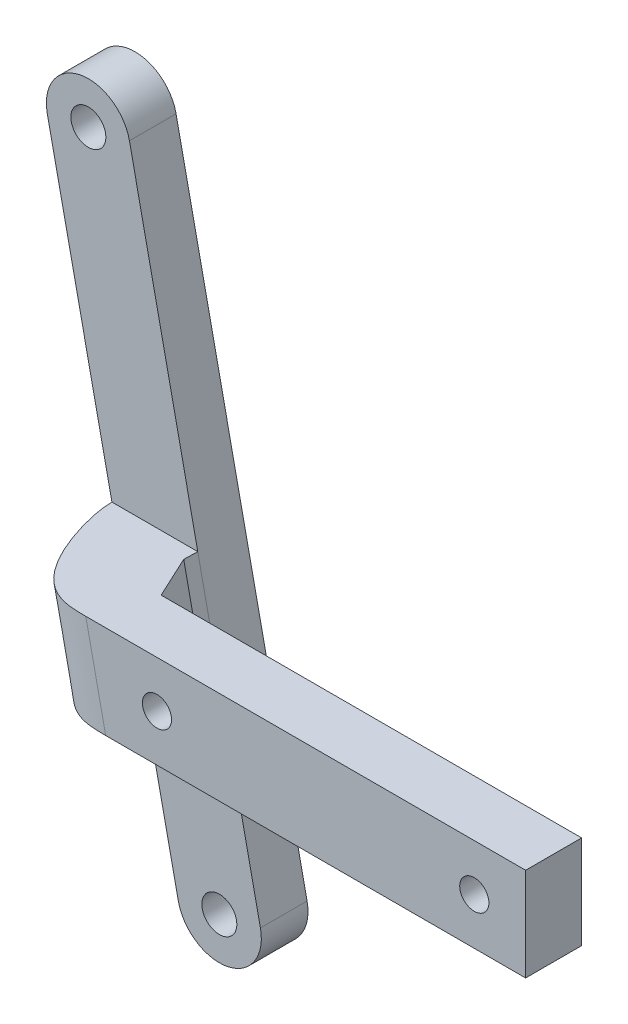
ISO-10303-21;
HEADER;
FILE_DESCRIPTION(('STEP AP214'),'2;1');
FILE_NAME('part.step','',(''),(''),'','','');
FILE_SCHEMA(('AUTOMOTIVE_DESIGN { 1 0 10303 214 1 1 1 1 }'));
ENDSEC;
DATA;
#1=APPLICATION_CONTEXT('core data for automotive mechanical design processes');
#2=APPLICATION_PROTOCOL_DEFINITION('international standard','automotive_design',2000,#1);
#3=PRODUCT_CONTEXT('',#1,'mechanical');
#4=PRODUCT('Part','Part','',(#3));
#5=PRODUCT_RELATED_PRODUCT_CATEGORY('part','',(#4));
#6=PRODUCT_DEFINITION_FORMATION('','',#4);
#7=PRODUCT_DEFINITION_CONTEXT('part definition',#1,'design');
#8=PRODUCT_DEFINITION('design','',#6,#7);
#9=PRODUCT_DEFINITION_SHAPE('','',#8);
#10=(LENGTH_UNIT() NAMED_UNIT(*) SI_UNIT(.MILLI.,.METRE.));
#11=(NAMED_UNIT(*) PLANE_ANGLE_UNIT() SI_UNIT($,.RADIAN.));
#12=(NAMED_UNIT(*) SI_UNIT($,.STERADIAN.) SOLID_ANGLE_UNIT());
#13=UNCERTAINTY_MEASURE_WITH_UNIT(LENGTH_MEASURE(1.E-05),#10,'distance_accuracy_value','');
#14=(GEOMETRIC_REPRESENTATION_CONTEXT(3) GLOBAL_UNCERTAINTY_ASSIGNED_CONTEXT((#13)) GLOBAL_UNIT_ASSIGNED_CONTEXT((#10,
#11,#12)) REPRESENTATION_CONTEXT('',''));
#15=CARTESIAN_POINT('',(0.,0.,0.));
#16=DIRECTION('',(0.,0.,1.));
#17=DIRECTION('',(1.,0.,0.));
#18=AXIS2_PLACEMENT_3D('',#15,#16,#17);
#19=CARTESIAN_POINT('',(0.,0.,10.));
#20=DIRECTION('',(0.,0.,1.));
#21=DIRECTION('',(1.,0.,0.));
#22=AXIS2_PLACEMENT_3D('',#19,#20,#21);
#23=PLANE('',#22);
#24=DIRECTION('',(-1.,0.,0.));
#25=VECTOR('',#24,1.);
#26=CARTESIAN_POINT('',(5.05083639806039,-67.049926099064,10.));
#27=LINE('',#26,#25);
#28=CARTESIAN_POINT('',(23.4529671056309,-67.0499260990639,10.));
#29=VERTEX_POINT('',#28);
#30=CARTESIAN_POINT('',(5.05083639806039,-67.0499260990639,10.));
#31=VERTEX_POINT('',#30);
#32=EDGE_CURVE('E357',#29,#31,#27,.T.);
#33=ORIENTED_EDGE('',*,*,#32,.F.);
#34=DIRECTION('',(-0.207911690817753,0.978147600733807,0.));
#35=VECTOR('',#34,1.);
#36=CARTESIAN_POINT('',(8.80332840660426,1.87120521735977,10.));
#37=LINE('',#36,#35);
#38=CARTESIAN_POINT('',(8.80332840660426,1.87120521735977,10.));
#39=VERTEX_POINT('',#38);
#40=EDGE_CURVE('E534',#29,#39,#37,.T.);
#41=ORIENTED_EDGE('',*,*,#40,.T.);
#42=CARTESIAN_POINT('',(0.,0.,10.));
#43=DIRECTION('',(0.,0.,1.));
#44=DIRECTION('',(1.,0.,0.));
#45=AXIS2_PLACEMENT_3D('',#42,#43,#44);
#46=CIRCLE('',#45,9.);
#47=CARTESIAN_POINT('',(-8.80332840660426,-1.87120521735977,10.));
#48=VERTEX_POINT('',#47);
#49=EDGE_CURVE('E519',#39,#48,#46,.T.);
#50=ORIENTED_EDGE('',*,*,#49,.T.);
#51=DIRECTION('',(0.207911690817753,-0.978147600733807,0.));
#52=VECTOR('',#51,1.);
#53=CARTESIAN_POINT('',(-8.80332840660426,-1.87120521735977,10.));
#54=LINE('',#53,#52);
#55=EDGE_CURVE('E562',#48,#31,#54,.T.);
#56=ORIENTED_EDGE('',*,*,#55,.T.);
#57=EDGE_LOOP('',(#33,#41,#50,#56));
#58=FACE_BOUND('',#57,.T.);
#59=CARTESIAN_POINT('',(0.,0.,10.));
#60=DIRECTION('',(0.,0.,1.));
#61=DIRECTION('',(1.,0.,0.));
#62=AXIS2_PLACEMENT_3D('',#59,#60,#61);
#63=CIRCLE('',#62,3.75);
#64=CARTESIAN_POINT('',(3.75,0.,10.));
#65=VERTEX_POINT('',#64);
#66=EDGE_CURVE('E541',#65,#65,#63,.T.);
#67=ORIENTED_EDGE('',*,*,#66,.F.);
#68=EDGE_LOOP('',(#67));
#69=FACE_BOUND('',#68,.T.);
#70=ADVANCED_FACE('F141',(#58,#69),#23,.T.);
#71=DIRECTION('',(1.,0.,0.));
#72=VECTOR('',#71,1.);
#73=CARTESIAN_POINT('',(27.7040983390312,-87.0499260990639,10.));
#74=LINE('',#73,#72);
#75=CARTESIAN_POINT('',(9.30196763146069,-87.0499260990639,10.));
#76=VERTEX_POINT('',#75);
#77=CARTESIAN_POINT('',(27.7040983390312,-87.0499260990639,10.));
#78=VERTEX_POINT('',#77);
#79=EDGE_CURVE('E297',#76,#78,#74,.T.);
#80=ORIENTED_EDGE('',*,*,#79,.F.);
#81=CARTESIAN_POINT('',(19.2647498537924,-133.921131316424,10.));
#82=VERTEX_POINT('',#81);
#83=EDGE_CURVE('E557',#76,#82,#54,.T.);
#84=ORIENTED_EDGE('',*,*,#83,.T.);
#85=CARTESIAN_POINT('',(28.0680782603966,-132.049926099064,10.));
#86=DIRECTION('',(0.,0.,1.));
#87=DIRECTION('',(1.,0.,0.));
#88=AXIS2_PLACEMENT_3D('',#85,#86,#87);
#89=CIRCLE('',#88,9.);
#90=CARTESIAN_POINT('',(36.8714066670009,-130.178720881704,10.));
#91=VERTEX_POINT('',#90);
#92=EDGE_CURVE('E509',#82,#91,#89,.T.);
#93=ORIENTED_EDGE('',*,*,#92,.T.);
#94=EDGE_CURVE('E527',#91,#78,#37,.T.);
#95=ORIENTED_EDGE('',*,*,#94,.T.);
#96=EDGE_LOOP('',(#80,#84,#93,#95));
#97=FACE_BOUND('',#96,.T.);
#98=CARTESIAN_POINT('',(28.0680782603966,-132.049926099064,10.));
#99=DIRECTION('',(0.,0.,1.));
#100=DIRECTION('',(1.,0.,0.));
#101=AXIS2_PLACEMENT_3D('',#98,#99,#100);
#102=CIRCLE('',#101,3.75000000000001);
#103=CARTESIAN_POINT('',(31.8180782603966,-132.049926099064,10.));
#104=VERTEX_POINT('',#103);
#105=EDGE_CURVE('E550',#104,#104,#102,.T.);
#106=ORIENTED_EDGE('',*,*,#105,.F.);
#107=EDGE_LOOP('',(#106));
#108=FACE_BOUND('',#107,.T.);
#109=ADVANCED_FACE('F465',(#97,#108),#23,.T.);
#110=CARTESIAN_POINT('',(0.,0.,0.));
#111=DIRECTION('',(0.,0.,1.));
#112=DIRECTION('',(1.,0.,0.));
#113=AXIS2_PLACEMENT_3D('',#110,#111,#112);
#114=PLANE('',#113);
#115=CARTESIAN_POINT('',(0.,0.,0.));
#116=DIRECTION('',(0.,0.,1.));
#117=DIRECTION('',(1.,0.,0.));
#118=AXIS2_PLACEMENT_3D('',#115,#116,#117);
#119=CIRCLE('',#118,9.);
#120=CARTESIAN_POINT('',(8.80332840660426,1.87120521735977,0.));
#121=VERTEX_POINT('',#120);
#122=CARTESIAN_POINT('',(-8.80332840660426,-1.87120521735977,0.));
#123=VERTEX_POINT('',#122);
#124=EDGE_CURVE('E505',#121,#123,#119,.T.);
#125=ORIENTED_EDGE('',*,*,#124,.F.);
#126=DIRECTION('',(-0.207911690817753,0.978147600733807,0.));
#127=VECTOR('',#126,1.);
#128=CARTESIAN_POINT('',(8.80332840660426,1.87120521735977,0.));
#129=LINE('',#128,#127);
#130=CARTESIAN_POINT('',(36.8714066670009,-130.178720881704,0.));
#131=VERTEX_POINT('',#130);
#132=EDGE_CURVE('E515',#131,#121,#129,.T.);
#133=ORIENTED_EDGE('',*,*,#132,.F.);
#134=CARTESIAN_POINT('',(28.0680782603966,-132.049926099064,0.));
#135=DIRECTION('',(0.,0.,1.));
#136=DIRECTION('',(1.,0.,0.));
#137=AXIS2_PLACEMENT_3D('',#134,#135,#136);
#138=CIRCLE('',#137,9.);
#139=CARTESIAN_POINT('',(19.2647498537924,-133.921131316424,0.));
#140=VERTEX_POINT('',#139);
#141=EDGE_CURVE('E504',#140,#131,#138,.T.);
#142=ORIENTED_EDGE('',*,*,#141,.F.);
#143=DIRECTION('',(0.207911690817753,-0.978147600733807,0.));
#144=VECTOR('',#143,1.);
#145=CARTESIAN_POINT('',(-8.80332840660426,-1.87120521735977,0.));
#146=LINE('',#145,#144);
#147=EDGE_CURVE('E495',#123,#140,#146,.T.);
#148=ORIENTED_EDGE('',*,*,#147,.F.);
#149=EDGE_LOOP('',(#125,#133,#142,#148));
#150=FACE_BOUND('',#149,.T.);
#151=CARTESIAN_POINT('',(0.,0.,0.));
#152=DIRECTION('',(0.,0.,1.));
#153=DIRECTION('',(1.,0.,0.));
#154=AXIS2_PLACEMENT_3D('',#151,#152,#153);
#155=CIRCLE('',#154,3.75);
#156=CARTESIAN_POINT('',(3.75,0.,0.));
#157=VERTEX_POINT('',#156);
#158=EDGE_CURVE('E544',#157,#157,#155,.T.);
#159=ORIENTED_EDGE('',*,*,#158,.T.);
#160=EDGE_LOOP('',(#159));
#161=FACE_BOUND('',#160,.T.);
#162=CARTESIAN_POINT('',(28.0680782603966,-132.049926099064,0.));
#163=DIRECTION('',(0.,0.,1.));
#164=DIRECTION('',(1.,0.,0.));
#165=AXIS2_PLACEMENT_3D('',#162,#163,#164);
#166=CIRCLE('',#165,3.75000000000001);
#167=CARTESIAN_POINT('',(31.8180782603966,-132.049926099064,0.));
#168=VERTEX_POINT('',#167);
#169=EDGE_CURVE('E553',#168,#168,#166,.T.);
#170=ORIENTED_EDGE('',*,*,#169,.T.);
#171=EDGE_LOOP('',(#170));
#172=FACE_BOUND('',#171,.T.);
#173=ADVANCED_FACE('F471',(#150,#161,#172),#114,.F.);
#174=CARTESIAN_POINT('',(0.,0.,10.));
#175=DIRECTION('',(0.,0.,-1.));
#176=DIRECTION('',(-1.,0.,0.));
#177=AXIS2_PLACEMENT_3D('',#174,#175,#176);
#178=CYLINDRICAL_SURFACE('',#177,9.);
#179=ORIENTED_EDGE('',*,*,#124,.T.);
#180=DIRECTION('',(0.,0.,-1.));
#181=VECTOR('',#180,1.);
#182=CARTESIAN_POINT('',(-8.80332840660426,-1.87120521735977,10.));
#183=LINE('',#182,#181);
#184=EDGE_CURVE('E12',#48,#123,#183,.T.);
#185=ORIENTED_EDGE('',*,*,#184,.F.);
#186=ORIENTED_EDGE('',*,*,#49,.F.);
#187=DIRECTION('',(0.,0.,-1.));
#188=VECTOR('',#187,1.);
#189=CARTESIAN_POINT('',(8.80332840660426,1.87120521735977,10.));
#190=LINE('',#189,#188);
#191=EDGE_CURVE('E523',#39,#121,#190,.T.);
#192=ORIENTED_EDGE('',*,*,#191,.T.);
#193=EDGE_LOOP('',(#179,#185,#186,#192));
#194=FACE_BOUND('',#193,.T.);
#195=ADVANCED_FACE('F143',(#194),#178,.T.);
#196=CARTESIAN_POINT('',(-8.80332840660426,-1.87120521735977,10.));
#197=DIRECTION('',(0.978147600733807,0.207911690817753,0.));
#198=DIRECTION('',(-0.207911690817753,0.978147600733807,0.));
#199=AXIS2_PLACEMENT_3D('',#196,#197,#198);
#200=PLANE('',#199);
#201=ORIENTED_EDGE('',*,*,#147,.T.);
#202=DIRECTION('',(0.,0.,-1.));
#203=VECTOR('',#202,1.);
#204=CARTESIAN_POINT('',(19.2647498537924,-133.921131316424,10.));
#205=LINE('',#204,#203);
#206=EDGE_CURVE('E152',#82,#140,#205,.T.);
#207=ORIENTED_EDGE('',*,*,#206,.F.);
#208=ORIENTED_EDGE('',*,*,#83,.F.);
#209=DIRECTION('',(0.207911690817753,-0.978147600733807,0.));
#210=VECTOR('',#209,1.);
#211=CARTESIAN_POINT('',(9.3019676314607,-87.0499260990639,10.));
#212=LINE('',#211,#210);
#213=EDGE_CURVE('E346',#31,#76,#212,.T.);
#214=ORIENTED_EDGE('',*,*,#213,.F.);
#215=ORIENTED_EDGE('',*,*,#55,.F.);
#216=ORIENTED_EDGE('',*,*,#184,.T.);
#217=EDGE_LOOP('',(#201,#207,#208,#214,#215,#216));
#218=FACE_BOUND('',#217,.T.);
#219=ADVANCED_FACE('F486',(#218),#200,.F.);
#220=CARTESIAN_POINT('',(28.0680782603966,-132.049926099064,10.));
#221=DIRECTION('',(0.,0.,-1.));
#222=DIRECTION('',(-1.,0.,0.));
#223=AXIS2_PLACEMENT_3D('',#220,#221,#222);
#224=CYLINDRICAL_SURFACE('',#223,9.);
#225=ORIENTED_EDGE('',*,*,#141,.T.);
#226=DIRECTION('',(0.,0.,-1.));
#227=VECTOR('',#226,1.);
#228=CARTESIAN_POINT('',(36.8714066670009,-130.178720881704,10.));
#229=LINE('',#228,#227);
#230=EDGE_CURVE('E511',#91,#131,#229,.T.);
#231=ORIENTED_EDGE('',*,*,#230,.F.);
#232=ORIENTED_EDGE('',*,*,#92,.F.);
#233=ORIENTED_EDGE('',*,*,#206,.T.);
#234=EDGE_LOOP('',(#225,#231,#232,#233));
#235=FACE_BOUND('',#234,.T.);
#236=ADVANCED_FACE('F483',(#235),#224,.T.);
#237=CARTESIAN_POINT('',(8.80332840660426,1.87120521735977,10.));
#238=DIRECTION('',(-0.978147600733807,-0.207911690817753,0.));
#239=DIRECTION('',(0.207911690817753,-0.978147600733807,0.));
#240=AXIS2_PLACEMENT_3D('',#237,#238,#239);
#241=PLANE('',#240);
#242=ORIENTED_EDGE('',*,*,#132,.T.);
#243=ORIENTED_EDGE('',*,*,#191,.F.);
#244=ORIENTED_EDGE('',*,*,#40,.F.);
#245=DIRECTION('',(-0.207911690817753,0.978147600733807,0.));
#246=VECTOR('',#245,1.);
#247=CARTESIAN_POINT('',(23.4529671056309,-67.0499260990639,10.));
#248=LINE('',#247,#246);
#249=EDGE_CURVE('E231',#78,#29,#248,.T.);
#250=ORIENTED_EDGE('',*,*,#249,.F.);
#251=ORIENTED_EDGE('',*,*,#94,.F.);
#252=ORIENTED_EDGE('',*,*,#230,.T.);
#253=EDGE_LOOP('',(#242,#243,#244,#250,#251,#252));
#254=FACE_BOUND('',#253,.T.);
#255=ADVANCED_FACE('F480',(#254),#241,.F.);
#256=CARTESIAN_POINT('',(0.,0.,10.));
#257=DIRECTION('',(0.,0.,-1.));
#258=DIRECTION('',(-1.,0.,0.));
#259=AXIS2_PLACEMENT_3D('',#256,#257,#258);
#260=CYLINDRICAL_SURFACE('',#259,3.75);
#261=ORIENTED_EDGE('',*,*,#66,.T.);
#262=EDGE_LOOP('',(#261));
#263=FACE_BOUND('',#262,.T.);
#264=ORIENTED_EDGE('',*,*,#158,.F.);
#265=EDGE_LOOP('',(#264));
#266=FACE_BOUND('',#265,.T.);
#267=ADVANCED_FACE('F476',(#263,#266),#260,.F.);
#268=CARTESIAN_POINT('',(28.0680782603966,-132.049926099064,10.));
#269=DIRECTION('',(0.,0.,-1.));
#270=DIRECTION('',(-1.,0.,0.));
#271=AXIS2_PLACEMENT_3D('',#268,#269,#270);
#272=CYLINDRICAL_SURFACE('',#271,3.75000000000001);
#273=ORIENTED_EDGE('',*,*,#105,.T.);
#274=EDGE_LOOP('',(#273));
#275=FACE_BOUND('',#274,.T.);
#276=ORIENTED_EDGE('',*,*,#169,.F.);
#277=EDGE_LOOP('',(#276));
#278=FACE_BOUND('',#277,.T.);
#279=ADVANCED_FACE('F389',(#275,#278),#272,.F.);
#280=CARTESIAN_POINT('',(23.0929671056309,-67.0499260990639,18.25));
#281=DIRECTION('',(0.,1.,0.));
#282=DIRECTION('',(0.,0.,1.));
#283=AXIS2_PLACEMENT_3D('',#280,#281,#282);
#284=PLANE('',#283);
#285=CARTESIAN_POINT('',(5.05083639806039,-67.049926099064,10.));
#286=CARTESIAN_POINT('',(5.05083639806039,-67.049926099064,14.9248597902253));
#287=CARTESIAN_POINT('',(7.43768095626114,-67.049926099064,22.1248597902253));
#288=CARTESIAN_POINT('',(10.9177884893493,-67.0499260990639,34.));
#289=CARTESIAN_POINT('',(17.1853777974901,-67.0499260990639,34.));
#290=CARTESIAN_POINT('',(23.4529671056309,-67.0499260990639,34.));
#291=B_SPLINE_CURVE_WITH_KNOTS('',5,(#285,#286,#287,#288,#289,#290),.UNSPECIFIED.,.F.,.F.,(6,6),
(0.,1.),.UNSPECIFIED.);
#292=CARTESIAN_POINT('',(23.4529671056309,-67.0499260990639,34.));
#293=VERTEX_POINT('',#292);
#294=EDGE_CURVE('E345',#31,#293,#291,.T.);
#295=ORIENTED_EDGE('',*,*,#294,.T.);
#296=DIRECTION('',(-1.,0.,0.));
#297=VECTOR('',#296,1.);
#298=CARTESIAN_POINT('',(23.4529671056309,-67.0499260990639,34.));
#299=LINE('',#298,#297);
#300=CARTESIAN_POINT('',(117.704098339031,-67.0499260990639,34.));
#301=VERTEX_POINT('',#300);
#302=EDGE_CURVE('E293',#301,#293,#299,.T.);
#303=ORIENTED_EDGE('',*,*,#302,.F.);
#304=DIRECTION('',(0.,0.,1.));
#305=VECTOR('',#304,1.);
#306=CARTESIAN_POINT('',(117.704098339031,-67.0499260990639,22.));
#307=LINE('',#306,#305);
#308=CARTESIAN_POINT('',(117.704098339031,-67.0499260990639,22.));
#309=VERTEX_POINT('',#308);
#310=EDGE_CURVE('E294',#309,#301,#307,.T.);
#311=ORIENTED_EDGE('',*,*,#310,.F.);
#312=DIRECTION('',(-1.,0.,0.));
#313=VECTOR('',#312,1.);
#314=CARTESIAN_POINT('',(23.4529671056309,-67.0499260990639,22.));
#315=LINE('',#314,#313);
#316=CARTESIAN_POINT('',(27.5966526294072,-67.0499260990639,22.));
#317=VERTEX_POINT('',#316);
#318=EDGE_CURVE('E254',#309,#317,#315,.T.);
#319=ORIENTED_EDGE('',*,*,#318,.T.);
#320=DIRECTION('',(-0.422618261740704,0.,-0.906307787036648));
#321=VECTOR('',#320,1.);
#322=CARTESIAN_POINT('',(23.3704700120002,-67.0499260990639,12.9369221296336));
#323=LINE('',#322,#321);
#324=CARTESIAN_POINT('',(23.3702893362008,-67.0499260990639,12.9365350589413));
#325=VERTEX_POINT('',#324);
#326=EDGE_CURVE('E245',#317,#325,#323,.T.);
#327=ORIENTED_EDGE('',*,*,#326,.T.);
#328=CARTESIAN_POINT('',(23.4529671056309,-67.0499260990639,10.));
#329=CARTESIAN_POINT('',(23.4529671056309,-67.0499260990639,12.4));
#330=CARTESIAN_POINT('',(23.2609671056309,-67.0499260990639,16.));
#331=CARTESIAN_POINT('',(22.6849671056309,-67.0499260990639,22.));
#332=CARTESIAN_POINT('',(23.0689671056309,-67.0499260990639,22.));
#333=CARTESIAN_POINT('',(23.4529671056309,-67.0499260990639,22.));
#334=B_SPLINE_CURVE_WITH_KNOTS('',5,(#328,#329,#330,#331,#332,#333),.UNSPECIFIED.,.F.,.F.,(6,6),
(0.,1.),.UNSPECIFIED.);
#335=EDGE_CURVE('E228',#29,#325,#334,.T.);
#336=ORIENTED_EDGE('',*,*,#335,.F.);
#337=ORIENTED_EDGE('',*,*,#32,.T.);
#338=EDGE_LOOP('',(#295,#303,#311,#319,#327,#336,#337));
#339=FACE_BOUND('',#338,.T.);
#340=ADVANCED_FACE('F252',(#339),#284,.T.);
#341=CARTESIAN_POINT('',(27.7040983390312,-87.0499260990639,10.));
#342=CARTESIAN_POINT('',(27.7040983390312,-87.0499260990639,12.4));
#343=CARTESIAN_POINT('',(27.5120983390312,-87.0499260990639,16.));
#344=CARTESIAN_POINT('',(26.9360983390313,-87.0499260990639,22.));
#345=CARTESIAN_POINT('',(27.3200983390312,-87.0499260990639,22.));
#346=CARTESIAN_POINT('',(27.7040983390312,-87.0499260990639,22.));
#347=CARTESIAN_POINT('',(26.8538720923511,-83.049926099064,10.));
#348=CARTESIAN_POINT('',(26.8538720923511,-83.049926099064,12.3999999999999));
#349=CARTESIAN_POINT('',(26.661872092357,-83.049926098225,16.0000000000755));
#350=CARTESIAN_POINT('',(26.0858720923748,-83.0499260957083,22.0000000003022));
#351=CARTESIAN_POINT('',(26.4698720923629,-83.0499260973861,22.0000000001511));
#352=CARTESIAN_POINT('',(26.8538720923511,-83.049926099064,22.));
#353=CARTESIAN_POINT('',(26.0036458456711,-79.049926099064,10.));
#354=CARTESIAN_POINT('',(26.0036458456711,-79.049926099064,12.4));
#355=CARTESIAN_POINT('',(25.8116458456782,-79.0499260981734,16.0000000000755));
#356=CARTESIAN_POINT('',(25.2356458456996,-79.0499260955019,22.0000000003022));
#357=CARTESIAN_POINT('',(25.6196458456854,-79.0499260972829,22.0000000001511));
#358=CARTESIAN_POINT('',(26.0036458456711,-79.049926099064,22.));
#359=CARTESIAN_POINT('',(25.1534195989911,-75.0499260990639,10.));
#360=CARTESIAN_POINT('',(25.1534195989911,-75.0499260990639,12.4));
#361=CARTESIAN_POINT('',(24.9614195989965,-75.0499260985412,16.0000000000378));
#362=CARTESIAN_POINT('',(24.3854195990127,-75.0499260969731,22.0000000001511));
#363=CARTESIAN_POINT('',(24.7694195990019,-75.0499260980185,22.0000000000756));
#364=CARTESIAN_POINT('',(25.1534195989911,-75.0499260990639,22.));
#365=CARTESIAN_POINT('',(24.303193352311,-71.049926099064,10.));
#366=CARTESIAN_POINT('',(24.303193352311,-71.049926099064,12.4));
#367=CARTESIAN_POINT('',(24.1111933523134,-71.0499260989607,16.));
#368=CARTESIAN_POINT('',(23.5351933523207,-71.049926098651,22.));
#369=CARTESIAN_POINT('',(23.9191933523159,-71.0499260988575,22.));
#370=CARTESIAN_POINT('',(24.303193352311,-71.049926099064,22.));
#371=CARTESIAN_POINT('',(23.4529671056309,-67.0499260990639,10.));
#372=CARTESIAN_POINT('',(23.4529671056309,-67.0499260990639,12.4));
#373=CARTESIAN_POINT('',(23.2609671056309,-67.0499260990639,16.));
#374=CARTESIAN_POINT('',(22.6849671056309,-67.0499260990639,22.));
#375=CARTESIAN_POINT('',(23.0689671056309,-67.0499260990639,22.));
#376=CARTESIAN_POINT('',(23.4529671056309,-67.0499260990639,22.));
#377=B_SPLINE_SURFACE_WITH_KNOTS('',5,5,((#341,#342,#343,#344,#345,#346),(#347,#348,#349,#350,
#351,#352),(#353,#354,#355,#356,#357,#358),(#359,#360,#361,#362,#363,#364),(#365,#366,#367,#368,
#369,#370),(#371,#372,#373,#374,#375,#376)),.UNSPECIFIED.,.F.,.F.,.F.,(6,6),(6,6),(0.,1.),(0.,
1.),.UNSPECIFIED.);
#378=DIRECTION('',(-0.207911690817753,0.978147600733807,0.));
#379=VECTOR('',#378,1.);
#380=CARTESIAN_POINT('',(29.7555959400015,-97.089581792751,12.9369221296336));
#381=LINE('',#380,#379);
#382=CARTESIAN_POINT('',(27.6214190099043,-87.0499260990639,12.9365313517432));
#383=VERTEX_POINT('',#382);
#384=EDGE_CURVE('E160',#383,#325,#381,.T.);
#385=CARTESIAN_POINT('',(27.7040983390312,-87.0499260990639,10.));
#386=CARTESIAN_POINT('',(27.7040983390312,-87.0499260990639,12.4));
#387=CARTESIAN_POINT('',(27.5120983390312,-87.0499260990639,16.));
#388=CARTESIAN_POINT('',(26.9360983390313,-87.0499260990639,22.));
#389=CARTESIAN_POINT('',(27.3200983390312,-87.0499260990639,22.));
#390=CARTESIAN_POINT('',(27.7040983390312,-87.0499260990639,22.));
#391=B_SPLINE_CURVE_WITH_KNOTS('',5,(#385,#386,#387,#388,#389,#390),.UNSPECIFIED.,.F.,.F.,(6,6),
(0.,1.),.UNSPECIFIED.);
#392=EDGE_CURVE('E145',#78,#383,#391,.T.);
#393=ORIENTED_EDGE('',*,*,#384,.F.);
#394=ORIENTED_EDGE('',*,*,#392,.F.);
#395=ORIENTED_EDGE('',*,*,#249,.T.);
#396=ORIENTED_EDGE('',*,*,#335,.T.);
#397=EDGE_LOOP('',(#393,#394,#395,#396));
#398=FACE_BOUND('',#397,.T.);
#399=ADVANCED_FACE('F230',(#398),#377,.T.);
#400=CARTESIAN_POINT('',(14.3523677626987,-87.0499260990639,26.5585280266681));
#401=DIRECTION('',(0.,-1.,0.));
#402=DIRECTION('',(0.,0.,-1.));
#403=AXIS2_PLACEMENT_3D('',#400,#401,#402);
#404=PLANE('',#403);
#405=ORIENTED_EDGE('',*,*,#392,.T.);
#406=DIRECTION('',(-0.422618261740704,0.,-0.906307787036648));
#407=VECTOR('',#406,1.);
#408=CARTESIAN_POINT('',(28.0027459182879,-87.0499260990639,13.7542895183558));
#409=LINE('',#408,#407);
#410=CARTESIAN_POINT('',(31.8477838628075,-87.0499260990639,22.));
#411=VERTEX_POINT('',#410);
#412=EDGE_CURVE('E246',#411,#383,#409,.T.);
#413=ORIENTED_EDGE('',*,*,#412,.F.);
#414=DIRECTION('',(1.,0.,0.));
#415=VECTOR('',#414,1.);
#416=CARTESIAN_POINT('',(27.7040983390312,-87.0499260990639,22.));
#417=LINE('',#416,#415);
#418=CARTESIAN_POINT('',(117.704098339031,-87.0499260990639,22.));
#419=VERTEX_POINT('',#418);
#420=EDGE_CURVE('E168',#411,#419,#417,.T.);
#421=ORIENTED_EDGE('',*,*,#420,.T.);
#422=DIRECTION('',(0.,0.,1.));
#423=VECTOR('',#422,1.);
#424=CARTESIAN_POINT('',(117.704098339031,-87.0499260990639,22.));
#425=LINE('',#424,#423);
#426=CARTESIAN_POINT('',(117.704098339031,-87.0499260990639,34.));
#427=VERTEX_POINT('',#426);
#428=EDGE_CURVE('E298',#419,#427,#425,.T.);
#429=ORIENTED_EDGE('',*,*,#428,.T.);
#430=DIRECTION('',(1.,0.,0.));
#431=VECTOR('',#430,1.);
#432=CARTESIAN_POINT('',(27.7040983390312,-87.0499260990639,34.));
#433=LINE('',#432,#431);
#434=CARTESIAN_POINT('',(27.7040983390312,-87.0499260990639,34.));
#435=VERTEX_POINT('',#434);
#436=EDGE_CURVE('E281',#435,#427,#433,.T.);
#437=ORIENTED_EDGE('',*,*,#436,.F.);
#438=CARTESIAN_POINT('',(9.3019676314607,-87.0499260990639,10.));
#439=CARTESIAN_POINT('',(9.3019676314607,-87.0499260990639,14.9248597902253));
#440=CARTESIAN_POINT('',(11.6888121896615,-87.0499260990639,22.1248597902253));
#441=CARTESIAN_POINT('',(15.1689197227497,-87.0499260990639,34.));
#442=CARTESIAN_POINT('',(21.4365090308904,-87.0499260990639,34.));
#443=CARTESIAN_POINT('',(27.7040983390312,-87.0499260990639,34.));
#444=B_SPLINE_CURVE_WITH_KNOTS('',5,(#438,#439,#440,#441,#442,#443),.UNSPECIFIED.,.F.,.F.,(6,6),
(0.,1.),.UNSPECIFIED.);
#445=EDGE_CURVE('E352',#76,#435,#444,.T.);
#446=ORIENTED_EDGE('',*,*,#445,.F.);
#447=ORIENTED_EDGE('',*,*,#79,.T.);
#448=EDGE_LOOP('',(#405,#413,#421,#429,#437,#446,#447));
#449=FACE_BOUND('',#448,.T.);
#450=ADVANCED_FACE('F323',(#449),#404,.T.);
#451=CARTESIAN_POINT('',(5.05083639806039,-67.049926099064,10.));
#452=CARTESIAN_POINT('',(5.05083639806039,-67.049926099064,14.9248597902253));
#453=CARTESIAN_POINT('',(7.43768095626114,-67.049926099064,22.1248597902253));
#454=CARTESIAN_POINT('',(10.9177884893493,-67.0499260990639,34.));
#455=CARTESIAN_POINT('',(17.1853777974901,-67.0499260990639,34.));
#456=CARTESIAN_POINT('',(23.4529671056309,-67.0499260990639,34.));
#457=CARTESIAN_POINT('',(5.90106264474046,-71.049926099064,10.));
#458=CARTESIAN_POINT('',(5.90106264474046,-71.049926099064,14.9248597902253));
#459=CARTESIAN_POINT('',(8.2879072028798,-71.0499261049518,22.1248597862797));
#460=CARTESIAN_POINT('',(11.7680147357838,-71.0499261226153,33.9999999842174));
#461=CARTESIAN_POINT('',(18.0356040440474,-71.0499261108396,33.9999999921087));
#462=CARTESIAN_POINT('',(24.303193352311,-71.049926099064,34.));
#463=CARTESIAN_POINT('',(6.75128889142052,-75.0499260990642,9.99999999999999));
#464=CARTESIAN_POINT('',(6.75128889142052,-75.0499260990642,14.9248597902253));
#465=CARTESIAN_POINT('',(9.13813344974843,-75.0499261055031,22.1248597862797));
#466=CARTESIAN_POINT('',(12.6182409832181,-75.04992612482,33.9999999842175));
#467=CARTESIAN_POINT('',(18.8858302911045,-75.049926111942,33.9999999921088));
#468=CARTESIAN_POINT('',(25.153419598991,-75.0499260990641,34.0000000000001));
#469=CARTESIAN_POINT('',(7.60151513810057,-79.0499260990642,10.));
#470=CARTESIAN_POINT('',(7.60151513810057,-79.0499260990642,14.9248597902253));
#471=CARTESIAN_POINT('',(9.98835969664775,-79.0499261031104,22.1248597882525));
#472=CARTESIAN_POINT('',(13.4684672307752,-79.0499261152491,33.9999999921087));
#473=CARTESIAN_POINT('',(19.7360565382231,-79.0499261071567,33.9999999960544));
#474=CARTESIAN_POINT('',(26.003645845671,-79.0499260990643,34.));
#475=CARTESIAN_POINT('',(8.45174138478064,-83.049926099064,10.));
#476=CARTESIAN_POINT('',(8.45174138478064,-83.049926099064,14.9248597902253));
#477=CARTESIAN_POINT('',(10.8385859433585,-83.0499261001662,22.1248597902253));
#478=CARTESIAN_POINT('',(14.3186934775781,-83.0499261034731,34.));
#479=CARTESIAN_POINT('',(20.5862827849646,-83.0499261012685,34.));
#480=CARTESIAN_POINT('',(26.8538720923511,-83.049926099064,34.));
#481=CARTESIAN_POINT('',(9.3019676314607,-87.0499260990639,10.));
#482=CARTESIAN_POINT('',(9.3019676314607,-87.0499260990639,14.9248597902253));
#483=CARTESIAN_POINT('',(11.6888121896615,-87.0499260990639,22.1248597902253));
#484=CARTESIAN_POINT('',(15.1689197227497,-87.0499260990639,34.));
#485=CARTESIAN_POINT('',(21.4365090308904,-87.0499260990639,34.));
#486=CARTESIAN_POINT('',(27.7040983390312,-87.0499260990639,34.));
#487=B_SPLINE_SURFACE_WITH_KNOTS('',5,5,((#451,#452,#453,#454,#455,#456),(#457,#458,#459,#460,
#461,#462),(#463,#464,#465,#466,#467,#468),(#469,#470,#471,#472,#473,#474),(#475,#476,#477,#478,
#479,#480),(#481,#482,#483,#484,#485,#486)),.UNSPECIFIED.,.F.,.F.,.F.,(6,6),(6,6),(0.,1.),(0.,
1.),.UNSPECIFIED.);
#488=DIRECTION('',(0.207911690817753,-0.978147600733807,0.));
#489=VECTOR('',#488,1.);
#490=CARTESIAN_POINT('',(23.4529671056309,-67.0499260990639,34.));
#491=LINE('',#490,#489);
#492=EDGE_CURVE('E237',#293,#435,#491,.T.);
#493=ORIENTED_EDGE('',*,*,#445,.T.);
#494=ORIENTED_EDGE('',*,*,#492,.F.);
#495=ORIENTED_EDGE('',*,*,#294,.F.);
#496=ORIENTED_EDGE('',*,*,#213,.T.);
#497=EDGE_LOOP('',(#493,#494,#495,#496));
#498=FACE_BOUND('',#497,.T.);
#499=ADVANCED_FACE('F310',(#498),#487,.T.);
#500=CARTESIAN_POINT('',(117.704098339031,-67.0499260990639,22.));
#501=DIRECTION('',(1.,0.,0.));
#502=DIRECTION('',(0.,0.,-1.));
#503=AXIS2_PLACEMENT_3D('',#500,#501,#502);
#504=PLANE('',#503);
#505=DIRECTION('',(0.,1.,0.));
#506=VECTOR('',#505,1.);
#507=CARTESIAN_POINT('',(117.704098339031,-67.0499260990639,34.));
#508=LINE('',#507,#506);
#509=EDGE_CURVE('E289',#427,#301,#508,.T.);
#510=ORIENTED_EDGE('',*,*,#509,.F.);
#511=ORIENTED_EDGE('',*,*,#428,.F.);
#512=DIRECTION('',(0.,1.,0.));
#513=VECTOR('',#512,1.);
#514=CARTESIAN_POINT('',(117.704098339031,-67.0499260990639,22.));
#515=LINE('',#514,#513);
#516=EDGE_CURVE('E285',#419,#309,#515,.T.);
#517=ORIENTED_EDGE('',*,*,#516,.T.);
#518=ORIENTED_EDGE('',*,*,#310,.T.);
#519=EDGE_LOOP('',(#510,#511,#517,#518));
#520=FACE_BOUND('',#519,.T.);
#521=ADVANCED_FACE('F322',(#520),#504,.T.);
#522=CARTESIAN_POINT('',(0.,0.,22.));
#523=DIRECTION('',(0.,0.,1.));
#524=DIRECTION('',(1.,0.,0.));
#525=AXIS2_PLACEMENT_3D('',#522,#523,#524);
#526=PLANE('',#525);
#527=CARTESIAN_POINT('',(38.7040983390312,-77.0499260990639,22.));
#528=DIRECTION('',(0.,0.,1.));
#529=DIRECTION('',(1.,0.,0.));
#530=AXIS2_PLACEMENT_3D('',#527,#528,#529);
#531=CIRCLE('',#530,3.125);
#532=CARTESIAN_POINT('',(41.8290983390312,-77.0499260990639,22.));
#533=VERTEX_POINT('',#532);
#534=EDGE_CURVE('E269',#533,#533,#531,.T.);
#535=ORIENTED_EDGE('',*,*,#534,.T.);
#536=EDGE_LOOP('',(#535));
#537=FACE_BOUND('',#536,.T.);
#538=CARTESIAN_POINT('',(106.704098339031,-77.0499260990639,22.));
#539=DIRECTION('',(0.,0.,1.));
#540=DIRECTION('',(1.,0.,0.));
#541=AXIS2_PLACEMENT_3D('',#538,#539,#540);
#542=CIRCLE('',#541,3.125);
#543=CARTESIAN_POINT('',(109.829098339031,-77.0499260990639,22.));
#544=VERTEX_POINT('',#543);
#545=EDGE_CURVE('E277',#544,#544,#542,.T.);
#546=ORIENTED_EDGE('',*,*,#545,.T.);
#547=EDGE_LOOP('',(#546));
#548=FACE_BOUND('',#547,.T.);
#549=ORIENTED_EDGE('',*,*,#420,.F.);
#550=DIRECTION('',(-0.207911690817753,0.978147600733807,0.));
#551=VECTOR('',#550,1.);
#552=CARTESIAN_POINT('',(33.9817785574085,-97.089581792751,22.0000000000001));
#553=LINE('',#552,#551);
#554=EDGE_CURVE('E256',#411,#317,#553,.T.);
#555=ORIENTED_EDGE('',*,*,#554,.T.);
#556=ORIENTED_EDGE('',*,*,#318,.F.);
#557=ORIENTED_EDGE('',*,*,#516,.F.);
#558=EDGE_LOOP('',(#549,#555,#556,#557));
#559=FACE_BOUND('',#558,.T.);
#560=ADVANCED_FACE('F449',(#537,#548,#559),#526,.F.);
#561=CARTESIAN_POINT('',(0.,0.,34.));
#562=DIRECTION('',(0.,0.,1.));
#563=DIRECTION('',(1.,0.,0.));
#564=AXIS2_PLACEMENT_3D('',#561,#562,#563);
#565=PLANE('',#564);
#566=CARTESIAN_POINT('',(38.7040983390312,-77.0499260990639,34.));
#567=DIRECTION('',(0.,0.,1.));
#568=DIRECTION('',(1.,0.,0.));
#569=AXIS2_PLACEMENT_3D('',#566,#567,#568);
#570=CIRCLE('',#569,3.125);
#571=CARTESIAN_POINT('',(41.8290983390312,-77.0499260990639,34.));
#572=VERTEX_POINT('',#571);
#573=EDGE_CURVE('E248',#572,#572,#570,.T.);
#574=ORIENTED_EDGE('',*,*,#573,.F.);
#575=EDGE_LOOP('',(#574));
#576=FACE_BOUND('',#575,.T.);
#577=CARTESIAN_POINT('',(106.704098339031,-77.0499260990639,34.));
#578=DIRECTION('',(0.,0.,1.));
#579=DIRECTION('',(1.,0.,0.));
#580=AXIS2_PLACEMENT_3D('',#577,#578,#579);
#581=CIRCLE('',#580,3.125);
#582=CARTESIAN_POINT('',(109.829098339031,-77.0499260990639,34.));
#583=VERTEX_POINT('',#582);
#584=EDGE_CURVE('E273',#583,#583,#581,.T.);
#585=ORIENTED_EDGE('',*,*,#584,.F.);
#586=EDGE_LOOP('',(#585));
#587=FACE_BOUND('',#586,.T.);
#588=ORIENTED_EDGE('',*,*,#492,.T.);
#589=ORIENTED_EDGE('',*,*,#436,.T.);
#590=ORIENTED_EDGE('',*,*,#509,.T.);
#591=ORIENTED_EDGE('',*,*,#302,.T.);
#592=EDGE_LOOP('',(#588,#589,#590,#591));
#593=FACE_BOUND('',#592,.T.);
#594=ADVANCED_FACE('F439',(#576,#587,#593),#565,.T.);
#595=CARTESIAN_POINT('',(106.704098339031,-77.0499260990639,22.));
#596=DIRECTION('',(0.,0.,1.));
#597=DIRECTION('',(1.,0.,0.));
#598=AXIS2_PLACEMENT_3D('',#595,#596,#597);
#599=CYLINDRICAL_SURFACE('',#598,3.125);
#600=ORIENTED_EDGE('',*,*,#545,.F.);
#601=EDGE_LOOP('',(#600));
#602=FACE_BOUND('',#601,.T.);
#603=ORIENTED_EDGE('',*,*,#584,.T.);
#604=EDGE_LOOP('',(#603));
#605=FACE_BOUND('',#604,.T.);
#606=ADVANCED_FACE('F448',(#602,#605),#599,.F.);
#607=CARTESIAN_POINT('',(38.7040983390312,-77.0499260990639,22.));
#608=DIRECTION('',(0.,0.,1.));
#609=DIRECTION('',(1.,0.,0.));
#610=AXIS2_PLACEMENT_3D('',#607,#608,#609);
#611=CYLINDRICAL_SURFACE('',#610,3.125);
#612=ORIENTED_EDGE('',*,*,#534,.F.);
#613=EDGE_LOOP('',(#612));
#614=FACE_BOUND('',#613,.T.);
#615=ORIENTED_EDGE('',*,*,#573,.T.);
#616=EDGE_LOOP('',(#615));
#617=FACE_BOUND('',#616,.T.);
#618=ADVANCED_FACE('F456',(#614,#617),#611,.F.);
#619=CARTESIAN_POINT('',(29.7555959400015,-97.089581792751,12.9369221296336));
#620=DIRECTION('',(0.889944924574199,0.189163633243173,-0.414988133665127));
#621=DIRECTION('',(-0.422618261740704,0.,-0.906307787036648));
#622=AXIS2_PLACEMENT_3D('',#619,#620,#621);
#623=PLANE('',#622);
#624=ORIENTED_EDGE('',*,*,#554,.F.);
#625=ORIENTED_EDGE('',*,*,#412,.T.);
#626=ORIENTED_EDGE('',*,*,#384,.T.);
#627=ORIENTED_EDGE('',*,*,#326,.F.);
#628=EDGE_LOOP('',(#624,#625,#626,#627));
#629=FACE_BOUND('',#628,.T.);
#630=ADVANCED_FACE('F244',(#629),#623,.T.);
#631=CLOSED_SHELL('',(#70,#109,#173,#195,#219,#236,#255,#267,#279,#340,#399,#450,#499,#521,#560,
#594,#606,#618,#630));
#632=MANIFOLD_SOLID_BREP('B2',#631);
#633=ADVANCED_BREP_SHAPE_REPRESENTATION('',(#18,#632),#14);
#634=SHAPE_DEFINITION_REPRESENTATION(#9,#633);
ENDSEC;
END-ISO-10303-21;
